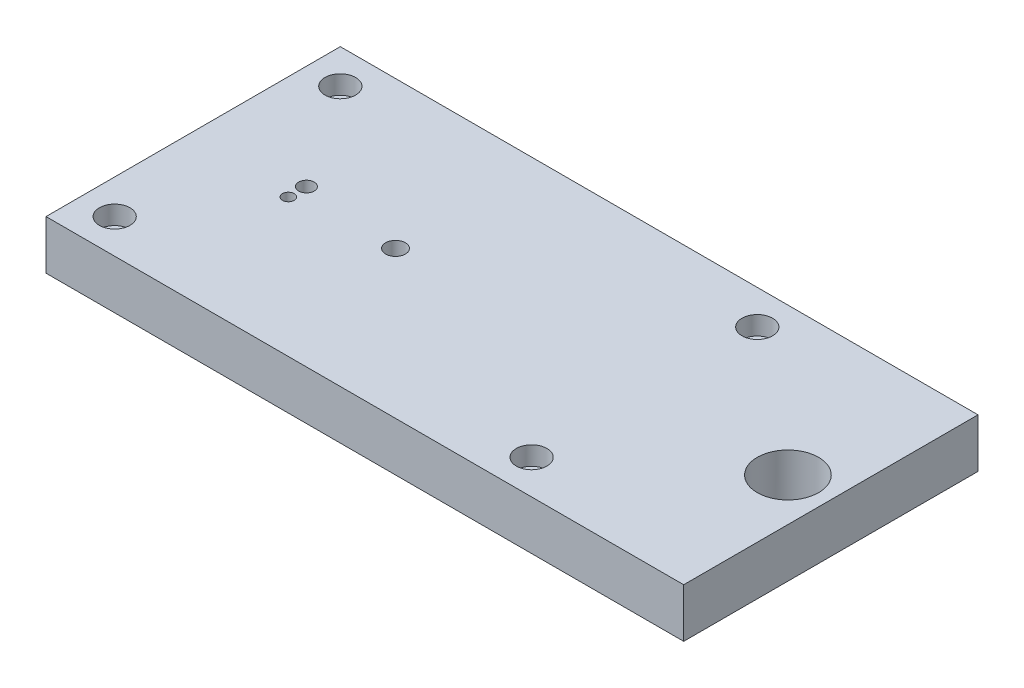
ISO-10303-21;
HEADER;
FILE_DESCRIPTION(('STEP AP214'),'2;1');
FILE_NAME('part.step','',(''),(''),'','','');
FILE_SCHEMA(('AUTOMOTIVE_DESIGN { 1 0 10303 214 1 1 1 1 }'));
ENDSEC;
DATA;
#1=APPLICATION_CONTEXT('core data for automotive mechanical design processes');
#2=APPLICATION_PROTOCOL_DEFINITION('international standard','automotive_design',2000,#1);
#3=PRODUCT_CONTEXT('',#1,'mechanical');
#4=PRODUCT('Part','Part','',(#3));
#5=PRODUCT_RELATED_PRODUCT_CATEGORY('part','',(#4));
#6=PRODUCT_DEFINITION_FORMATION('','',#4);
#7=PRODUCT_DEFINITION_CONTEXT('part definition',#1,'design');
#8=PRODUCT_DEFINITION('design','',#6,#7);
#9=PRODUCT_DEFINITION_SHAPE('','',#8);
#10=(LENGTH_UNIT() NAMED_UNIT(*) SI_UNIT(.MILLI.,.METRE.));
#11=(NAMED_UNIT(*) PLANE_ANGLE_UNIT() SI_UNIT($,.RADIAN.));
#12=(NAMED_UNIT(*) SI_UNIT($,.STERADIAN.) SOLID_ANGLE_UNIT());
#13=UNCERTAINTY_MEASURE_WITH_UNIT(LENGTH_MEASURE(1.E-05),#10,'distance_accuracy_value','');
#14=(GEOMETRIC_REPRESENTATION_CONTEXT(3) GLOBAL_UNCERTAINTY_ASSIGNED_CONTEXT((#13)) GLOBAL_UNIT_ASSIGNED_CONTEXT((#10,
#11,#12)) REPRESENTATION_CONTEXT('',''));
#15=CARTESIAN_POINT('',(0.,0.,0.));
#16=DIRECTION('',(0.,0.,1.));
#17=DIRECTION('',(1.,0.,0.));
#18=AXIS2_PLACEMENT_3D('',#15,#16,#17);
#19=CARTESIAN_POINT('',(-65.243599257885,12.7,52.8381261595547));
#20=DIRECTION('',(1.,0.,0.));
#21=DIRECTION('',(0.,0.,-1.));
#22=AXIS2_PLACEMENT_3D('',#19,#20,#21);
#23=PLANE('',#22);
#24=DIRECTION('',(0.,0.,1.));
#25=VECTOR('',#24,1.);
#26=CARTESIAN_POINT('',(-65.243599257885,0.,52.8381261595547));
#27=LINE('',#26,#25);
#28=CARTESIAN_POINT('',(-65.243599257885,0.,-23.3618738404453));
#29=VERTEX_POINT('',#28);
#30=CARTESIAN_POINT('',(-65.243599257885,0.,52.8381261595547));
#31=VERTEX_POINT('',#30);
#32=EDGE_CURVE('E99',#29,#31,#27,.T.);
#33=ORIENTED_EDGE('',*,*,#32,.T.);
#34=DIRECTION('',(0.,-1.,0.));
#35=VECTOR('',#34,1.);
#36=CARTESIAN_POINT('',(-65.243599257885,12.7,52.8381261595547));
#37=LINE('',#36,#35);
#38=CARTESIAN_POINT('',(-65.243599257885,12.7,52.8381261595547));
#39=VERTEX_POINT('',#38);
#40=EDGE_CURVE('E11',#39,#31,#37,.T.);
#41=ORIENTED_EDGE('',*,*,#40,.F.);
#42=DIRECTION('',(0.,0.,1.));
#43=VECTOR('',#42,1.);
#44=CARTESIAN_POINT('',(-65.243599257885,12.7,52.8381261595547));
#45=LINE('',#44,#43);
#46=CARTESIAN_POINT('',(-65.243599257885,12.7,-23.3618738404453));
#47=VERTEX_POINT('',#46);
#48=EDGE_CURVE('E86',#47,#39,#45,.T.);
#49=ORIENTED_EDGE('',*,*,#48,.F.);
#50=DIRECTION('',(0.,-1.,0.));
#51=VECTOR('',#50,1.);
#52=CARTESIAN_POINT('',(-65.243599257885,12.7,-23.3618738404453));
#53=LINE('',#52,#51);
#54=EDGE_CURVE('E95',#47,#29,#53,.T.);
#55=ORIENTED_EDGE('',*,*,#54,.T.);
#56=EDGE_LOOP('',(#33,#41,#49,#55));
#57=FACE_BOUND('',#56,.T.);
#58=ADVANCED_FACE('F33',(#57),#23,.F.);
#59=CARTESIAN_POINT('',(-65.243599257885,12.7,52.8381261595547));
#60=DIRECTION('',(0.,0.,-1.));
#61=DIRECTION('',(-1.,0.,0.));
#62=AXIS2_PLACEMENT_3D('',#59,#60,#61);
#63=PLANE('',#62);
#64=DIRECTION('',(1.,0.,0.));
#65=VECTOR('',#64,1.);
#66=CARTESIAN_POINT('',(-65.243599257885,0.,52.8381261595547));
#67=LINE('',#66,#65);
#68=CARTESIAN_POINT('',(99.8564007421151,0.,52.8381261595547));
#69=VERTEX_POINT('',#68);
#70=EDGE_CURVE('E90',#31,#69,#67,.T.);
#71=ORIENTED_EDGE('',*,*,#70,.T.);
#72=DIRECTION('',(0.,-1.,0.));
#73=VECTOR('',#72,1.);
#74=CARTESIAN_POINT('',(99.8564007421151,12.7,52.8381261595547));
#75=LINE('',#74,#73);
#76=CARTESIAN_POINT('',(99.8564007421151,12.7,52.8381261595547));
#77=VERTEX_POINT('',#76);
#78=EDGE_CURVE('E42',#77,#69,#75,.T.);
#79=ORIENTED_EDGE('',*,*,#78,.F.);
#80=DIRECTION('',(1.,0.,0.));
#81=VECTOR('',#80,1.);
#82=CARTESIAN_POINT('',(-65.243599257885,12.7,52.8381261595547));
#83=LINE('',#82,#81);
#84=EDGE_CURVE('E81',#39,#77,#83,.T.);
#85=ORIENTED_EDGE('',*,*,#84,.F.);
#86=ORIENTED_EDGE('',*,*,#40,.T.);
#87=EDGE_LOOP('',(#71,#79,#85,#86));
#88=FACE_BOUND('',#87,.T.);
#89=ADVANCED_FACE('F89',(#88),#63,.F.);
#90=CARTESIAN_POINT('',(99.8564007421151,12.7,52.8381261595547));
#91=DIRECTION('',(-1.,0.,0.));
#92=DIRECTION('',(0.,0.,1.));
#93=AXIS2_PLACEMENT_3D('',#90,#91,#92);
#94=PLANE('',#93);
#95=DIRECTION('',(0.,0.,-1.));
#96=VECTOR('',#95,1.);
#97=CARTESIAN_POINT('',(99.8564007421151,0.,52.8381261595547));
#98=LINE('',#97,#96);
#99=CARTESIAN_POINT('',(99.856400742115,0.,-23.3618738404453));
#100=VERTEX_POINT('',#99);
#101=EDGE_CURVE('E68',#69,#100,#98,.T.);
#102=ORIENTED_EDGE('',*,*,#101,.T.);
#103=DIRECTION('',(0.,-1.,0.));
#104=VECTOR('',#103,1.);
#105=CARTESIAN_POINT('',(99.856400742115,12.7,-23.3618738404453));
#106=LINE('',#105,#104);
#107=CARTESIAN_POINT('',(99.856400742115,12.7,-23.3618738404453));
#108=VERTEX_POINT('',#107);
#109=EDGE_CURVE('E91',#108,#100,#106,.T.);
#110=ORIENTED_EDGE('',*,*,#109,.F.);
#111=DIRECTION('',(0.,0.,-1.));
#112=VECTOR('',#111,1.);
#113=CARTESIAN_POINT('',(99.8564007421151,12.7,52.8381261595547));
#114=LINE('',#113,#112);
#115=EDGE_CURVE('E84',#77,#108,#114,.T.);
#116=ORIENTED_EDGE('',*,*,#115,.F.);
#117=ORIENTED_EDGE('',*,*,#78,.T.);
#118=EDGE_LOOP('',(#102,#110,#116,#117));
#119=FACE_BOUND('',#118,.T.);
#120=ADVANCED_FACE('F93',(#119),#94,.F.);
#121=CARTESIAN_POINT('',(-65.243599257885,12.7,-23.3618738404453));
#122=DIRECTION('',(0.,0.,1.));
#123=DIRECTION('',(1.,0.,0.));
#124=AXIS2_PLACEMENT_3D('',#121,#122,#123);
#125=PLANE('',#124);
#126=DIRECTION('',(-1.,0.,0.));
#127=VECTOR('',#126,1.);
#128=CARTESIAN_POINT('',(-65.243599257885,0.,-23.3618738404453));
#129=LINE('',#128,#127);
#130=EDGE_CURVE('E74',#100,#29,#129,.T.);
#131=ORIENTED_EDGE('',*,*,#130,.T.);
#132=ORIENTED_EDGE('',*,*,#54,.F.);
#133=DIRECTION('',(-1.,0.,0.));
#134=VECTOR('',#133,1.);
#135=CARTESIAN_POINT('',(-65.243599257885,12.7,-23.3618738404453));
#136=LINE('',#135,#134);
#137=EDGE_CURVE('E51',#108,#47,#136,.T.);
#138=ORIENTED_EDGE('',*,*,#137,.F.);
#139=ORIENTED_EDGE('',*,*,#109,.T.);
#140=EDGE_LOOP('',(#131,#132,#138,#139));
#141=FACE_BOUND('',#140,.T.);
#142=ADVANCED_FACE('F184',(#141),#125,.F.);
#143=CARTESIAN_POINT('',(0.,12.7,0.));
#144=DIRECTION('',(0.,-1.,0.));
#145=DIRECTION('',(0.,0.,-1.));
#146=AXIS2_PLACEMENT_3D('',#143,#144,#145);
#147=PLANE('',#146);
#148=CARTESIAN_POINT('',(-38.2560992578849,12.7,17.0749261595547));
#149=DIRECTION('',(0.,1.,0.));
#150=DIRECTION('',(0.,0.,1.));
#151=AXIS2_PLACEMENT_3D('',#148,#149,#150);
#152=CIRCLE('',#151,1.524);
#153=CARTESIAN_POINT('',(-38.2560992578849,12.7,18.5989261595547));
#154=VERTEX_POINT('',#153);
#155=EDGE_CURVE('E128',#154,#154,#152,.T.);
#156=ORIENTED_EDGE('',*,*,#155,.F.);
#157=EDGE_LOOP('',(#156));
#158=FACE_BOUND('',#157,.T.);
#159=CARTESIAN_POINT('',(-38.2560992578849,12.7,12.4013261595547));
#160=DIRECTION('',(0.,1.,0.));
#161=DIRECTION('',(0.,0.,1.));
#162=AXIS2_PLACEMENT_3D('',#159,#160,#161);
#163=CIRCLE('',#162,2.0193);
#164=CARTESIAN_POINT('',(-38.2560992578849,12.7,14.4206261595547));
#165=VERTEX_POINT('',#164);
#166=EDGE_CURVE('E118',#165,#165,#163,.T.);
#167=ORIENTED_EDGE('',*,*,#166,.F.);
#168=EDGE_LOOP('',(#167));
#169=FACE_BOUND('',#168,.T.);
#170=CARTESIAN_POINT('',(-12.856099257885,12.7,14.7381261595547));
#171=DIRECTION('',(0.,1.,0.));
#172=DIRECTION('',(0.,0.,1.));
#173=AXIS2_PLACEMENT_3D('',#170,#171,#172);
#174=CIRCLE('',#173,2.5527);
#175=CARTESIAN_POINT('',(-12.856099257885,12.7,17.2908261595547));
#176=VERTEX_POINT('',#175);
#177=EDGE_CURVE('E115',#176,#176,#174,.T.);
#178=ORIENTED_EDGE('',*,*,#177,.F.);
#179=EDGE_LOOP('',(#178));
#180=FACE_BOUND('',#179,.T.);
#181=CARTESIAN_POINT('',(88.743900742115,12.7,14.7381261595547));
#182=DIRECTION('',(0.,1.,0.));
#183=DIRECTION('',(0.,0.,1.));
#184=AXIS2_PLACEMENT_3D('',#181,#182,#183);
#185=CIRCLE('',#184,7.93749999999999);
#186=CARTESIAN_POINT('',(88.743900742115,12.7,22.6756261595547));
#187=VERTEX_POINT('',#186);
#188=EDGE_CURVE('E112',#187,#187,#185,.T.);
#189=ORIENTED_EDGE('',*,*,#188,.F.);
#190=EDGE_LOOP('',(#189));
#191=FACE_BOUND('',#190,.T.);
#192=CARTESIAN_POINT('',(51.5964007421151,12.7,43.9481261595547));
#193=DIRECTION('',(0.,1.,0.));
#194=DIRECTION('',(0.,0.,1.));
#195=AXIS2_PLACEMENT_3D('',#192,#193,#194);
#196=CIRCLE('',#195,3.96240000000001);
#197=CARTESIAN_POINT('',(51.5964007421151,12.7,47.9105261595547));
#198=VERTEX_POINT('',#197);
#199=EDGE_CURVE('E156',#198,#198,#196,.T.);
#200=ORIENTED_EDGE('',*,*,#199,.F.);
#201=EDGE_LOOP('',(#200));
#202=FACE_BOUND('',#201,.T.);
#203=CARTESIAN_POINT('',(51.5964007421151,12.7,-14.4718738404453));
#204=DIRECTION('',(0.,1.,0.));
#205=DIRECTION('',(0.,0.,1.));
#206=AXIS2_PLACEMENT_3D('',#203,#204,#205);
#207=CIRCLE('',#206,3.9624);
#208=CARTESIAN_POINT('',(51.5964007421151,12.7,-10.5094738404453));
#209=VERTEX_POINT('',#208);
#210=EDGE_CURVE('E160',#209,#209,#207,.T.);
#211=ORIENTED_EDGE('',*,*,#210,.F.);
#212=EDGE_LOOP('',(#211));
#213=FACE_BOUND('',#212,.T.);
#214=CARTESIAN_POINT('',(-56.353599257885,12.7,43.9481261595547));
#215=DIRECTION('',(0.,1.,0.));
#216=DIRECTION('',(0.,0.,1.));
#217=AXIS2_PLACEMENT_3D('',#214,#215,#216);
#218=CIRCLE('',#217,3.9624);
#219=CARTESIAN_POINT('',(-56.353599257885,12.7,47.9105261595547));
#220=VERTEX_POINT('',#219);
#221=EDGE_CURVE('E166',#220,#220,#218,.T.);
#222=ORIENTED_EDGE('',*,*,#221,.F.);
#223=EDGE_LOOP('',(#222));
#224=FACE_BOUND('',#223,.T.);
#225=CARTESIAN_POINT('',(-56.353599257885,12.7,-14.4718738404453));
#226=DIRECTION('',(0.,1.,0.));
#227=DIRECTION('',(0.,0.,1.));
#228=AXIS2_PLACEMENT_3D('',#225,#226,#227);
#229=CIRCLE('',#228,3.9624);
#230=CARTESIAN_POINT('',(-56.353599257885,12.7,-10.5094738404453));
#231=VERTEX_POINT('',#230);
#232=EDGE_CURVE('E172',#231,#231,#229,.T.);
#233=ORIENTED_EDGE('',*,*,#232,.F.);
#234=EDGE_LOOP('',(#233));
#235=FACE_BOUND('',#234,.T.);
#236=ORIENTED_EDGE('',*,*,#48,.T.);
#237=ORIENTED_EDGE('',*,*,#84,.T.);
#238=ORIENTED_EDGE('',*,*,#115,.T.);
#239=ORIENTED_EDGE('',*,*,#137,.T.);
#240=EDGE_LOOP('',(#236,#237,#238,#239));
#241=FACE_BOUND('',#240,.T.);
#242=ADVANCED_FACE('F82',(#158,#169,#180,#191,#202,#213,#224,#235,#241),#147,.F.);
#243=CARTESIAN_POINT('',(0.,0.,0.));
#244=DIRECTION('',(0.,-1.,0.));
#245=DIRECTION('',(0.,0.,-1.));
#246=AXIS2_PLACEMENT_3D('',#243,#244,#245);
#247=PLANE('',#246);
#248=CARTESIAN_POINT('',(-38.2560992578849,0.,17.0749261595547));
#249=DIRECTION('',(0.,-1.,0.));
#250=DIRECTION('',(0.,0.,-1.));
#251=AXIS2_PLACEMENT_3D('',#248,#249,#250);
#252=CIRCLE('',#251,1.524);
#253=CARTESIAN_POINT('',(-38.2560992578849,0.,15.5509261595547));
#254=VERTEX_POINT('',#253);
#255=EDGE_CURVE('E36',#254,#254,#252,.T.);
#256=ORIENTED_EDGE('',*,*,#255,.F.);
#257=EDGE_LOOP('',(#256));
#258=FACE_BOUND('',#257,.T.);
#259=CARTESIAN_POINT('',(-38.2560992578849,0.,12.4013261595547));
#260=DIRECTION('',(0.,-1.,0.));
#261=DIRECTION('',(0.,0.,-1.));
#262=AXIS2_PLACEMENT_3D('',#259,#260,#261);
#263=CIRCLE('',#262,2.0193);
#264=CARTESIAN_POINT('',(-38.2560992578849,0.,10.3820261595547));
#265=VERTEX_POINT('',#264);
#266=EDGE_CURVE('E116',#265,#265,#263,.T.);
#267=ORIENTED_EDGE('',*,*,#266,.F.);
#268=EDGE_LOOP('',(#267));
#269=FACE_BOUND('',#268,.T.);
#270=CARTESIAN_POINT('',(-12.856099257885,0.,14.7381261595547));
#271=DIRECTION('',(0.,-1.,0.));
#272=DIRECTION('',(0.,0.,-1.));
#273=AXIS2_PLACEMENT_3D('',#270,#271,#272);
#274=CIRCLE('',#273,2.5527);
#275=CARTESIAN_POINT('',(-12.856099257885,0.,12.1854261595547));
#276=VERTEX_POINT('',#275);
#277=EDGE_CURVE('E113',#276,#276,#274,.T.);
#278=ORIENTED_EDGE('',*,*,#277,.F.);
#279=EDGE_LOOP('',(#278));
#280=FACE_BOUND('',#279,.T.);
#281=CARTESIAN_POINT('',(88.743900742115,0.,14.7381261595547));
#282=DIRECTION('',(0.,-1.,0.));
#283=DIRECTION('',(0.,0.,-1.));
#284=AXIS2_PLACEMENT_3D('',#281,#282,#283);
#285=CIRCLE('',#284,7.93749999999999);
#286=CARTESIAN_POINT('',(88.743900742115,0.,6.80062615955474));
#287=VERTEX_POINT('',#286);
#288=EDGE_CURVE('E108',#287,#287,#285,.T.);
#289=ORIENTED_EDGE('',*,*,#288,.F.);
#290=EDGE_LOOP('',(#289));
#291=FACE_BOUND('',#290,.T.);
#292=CARTESIAN_POINT('',(51.5964007421151,0.,43.9481261595547));
#293=DIRECTION('',(0.,-1.,0.));
#294=DIRECTION('',(0.,0.,-1.));
#295=AXIS2_PLACEMENT_3D('',#292,#293,#294);
#296=CIRCLE('',#295,2.55270000000001);
#297=CARTESIAN_POINT('',(51.5964007421151,0.,41.3954261595547));
#298=VERTEX_POINT('',#297);
#299=EDGE_CURVE('E135',#298,#298,#296,.T.);
#300=ORIENTED_EDGE('',*,*,#299,.F.);
#301=EDGE_LOOP('',(#300));
#302=FACE_BOUND('',#301,.T.);
#303=CARTESIAN_POINT('',(51.5964007421151,0.,-14.4718738404453));
#304=DIRECTION('',(0.,-1.,0.));
#305=DIRECTION('',(0.,0.,-1.));
#306=AXIS2_PLACEMENT_3D('',#303,#304,#305);
#307=CIRCLE('',#306,2.55270000000001);
#308=CARTESIAN_POINT('',(51.5964007421151,0.,-17.0245738404453));
#309=VERTEX_POINT('',#308);
#310=EDGE_CURVE('E141',#309,#309,#307,.T.);
#311=ORIENTED_EDGE('',*,*,#310,.F.);
#312=EDGE_LOOP('',(#311));
#313=FACE_BOUND('',#312,.T.);
#314=CARTESIAN_POINT('',(-56.353599257885,0.,-14.4718738404453));
#315=DIRECTION('',(0.,-1.,0.));
#316=DIRECTION('',(0.,0.,-1.));
#317=AXIS2_PLACEMENT_3D('',#314,#315,#316);
#318=CIRCLE('',#317,2.5527);
#319=CARTESIAN_POINT('',(-56.353599257885,0.,-17.0245738404453));
#320=VERTEX_POINT('',#319);
#321=EDGE_CURVE('E147',#320,#320,#318,.T.);
#322=ORIENTED_EDGE('',*,*,#321,.F.);
#323=EDGE_LOOP('',(#322));
#324=FACE_BOUND('',#323,.T.);
#325=CARTESIAN_POINT('',(-56.353599257885,0.,43.9481261595547));
#326=DIRECTION('',(0.,-1.,0.));
#327=DIRECTION('',(0.,0.,-1.));
#328=AXIS2_PLACEMENT_3D('',#325,#326,#327);
#329=CIRCLE('',#328,2.5527);
#330=CARTESIAN_POINT('',(-56.353599257885,0.,41.3954261595547));
#331=VERTEX_POINT('',#330);
#332=EDGE_CURVE('E153',#331,#331,#329,.T.);
#333=ORIENTED_EDGE('',*,*,#332,.F.);
#334=EDGE_LOOP('',(#333));
#335=FACE_BOUND('',#334,.T.);
#336=ORIENTED_EDGE('',*,*,#32,.F.);
#337=ORIENTED_EDGE('',*,*,#130,.F.);
#338=ORIENTED_EDGE('',*,*,#101,.F.);
#339=ORIENTED_EDGE('',*,*,#70,.F.);
#340=EDGE_LOOP('',(#336,#337,#338,#339));
#341=FACE_BOUND('',#340,.T.);
#342=ADVANCED_FACE('F183',(#258,#269,#280,#291,#302,#313,#324,#335,#341),#247,.T.);
#343=CARTESIAN_POINT('',(-56.353599257885,7.874,-14.4718738404453));
#344=DIRECTION('',(0.,1.,0.));
#345=DIRECTION('',(0.,0.,1.));
#346=AXIS2_PLACEMENT_3D('',#343,#344,#345);
#347=CYLINDRICAL_SURFACE('',#346,3.9624);
#348=CARTESIAN_POINT('',(-56.353599257885,7.874,-14.4718738404453));
#349=DIRECTION('',(0.,1.,0.));
#350=DIRECTION('',(0.,0.,1.));
#351=AXIS2_PLACEMENT_3D('',#348,#349,#350);
#352=CIRCLE('',#351,3.9624);
#353=CARTESIAN_POINT('',(-56.353599257885,7.874,-10.5094738404453));
#354=VERTEX_POINT('',#353);
#355=EDGE_CURVE('E102',#354,#354,#352,.T.);
#356=ORIENTED_EDGE('',*,*,#355,.F.);
#357=EDGE_LOOP('',(#356));
#358=FACE_BOUND('',#357,.T.);
#359=ORIENTED_EDGE('',*,*,#232,.T.);
#360=EDGE_LOOP('',(#359));
#361=FACE_BOUND('',#360,.T.);
#362=ADVANCED_FACE('F180',(#358,#361),#347,.F.);
#363=CARTESIAN_POINT('',(-56.353599257885,7.874,-14.4718738404453));
#364=DIRECTION('',(0.,1.,0.));
#365=DIRECTION('',(0.,0.,1.));
#366=AXIS2_PLACEMENT_3D('',#363,#364,#365);
#367=PLANE('',#366);
#368=CARTESIAN_POINT('',(-56.353599257885,7.874,-14.4718738404453));
#369=DIRECTION('',(0.,1.,0.));
#370=DIRECTION('',(0.,0.,1.));
#371=AXIS2_PLACEMENT_3D('',#368,#369,#370);
#372=CIRCLE('',#371,2.5527);
#373=CARTESIAN_POINT('',(-56.353599257885,7.874,-11.9191738404453));
#374=VERTEX_POINT('',#373);
#375=EDGE_CURVE('E144',#374,#374,#372,.T.);
#376=ORIENTED_EDGE('',*,*,#375,.F.);
#377=EDGE_LOOP('',(#376));
#378=FACE_BOUND('',#377,.T.);
#379=ORIENTED_EDGE('',*,*,#355,.T.);
#380=EDGE_LOOP('',(#379));
#381=FACE_BOUND('',#380,.T.);
#382=ADVANCED_FACE('F224',(#378,#381),#367,.T.);
#383=CARTESIAN_POINT('',(-56.353599257885,7.874,43.9481261595547));
#384=DIRECTION('',(0.,1.,0.));
#385=DIRECTION('',(0.,0.,1.));
#386=AXIS2_PLACEMENT_3D('',#383,#384,#385);
#387=CYLINDRICAL_SURFACE('',#386,3.9624);
#388=CARTESIAN_POINT('',(-56.353599257885,7.874,43.9481261595547));
#389=DIRECTION('',(0.,1.,0.));
#390=DIRECTION('',(0.,0.,1.));
#391=AXIS2_PLACEMENT_3D('',#388,#389,#390);
#392=CIRCLE('',#391,3.9624);
#393=CARTESIAN_POINT('',(-56.353599257885,7.874,47.9105261595547));
#394=VERTEX_POINT('',#393);
#395=EDGE_CURVE('E169',#394,#394,#392,.T.);
#396=ORIENTED_EDGE('',*,*,#395,.F.);
#397=EDGE_LOOP('',(#396));
#398=FACE_BOUND('',#397,.T.);
#399=ORIENTED_EDGE('',*,*,#221,.T.);
#400=EDGE_LOOP('',(#399));
#401=FACE_BOUND('',#400,.T.);
#402=ADVANCED_FACE('F234',(#398,#401),#387,.F.);
#403=CARTESIAN_POINT('',(-56.353599257885,7.874,43.9481261595547));
#404=DIRECTION('',(0.,1.,0.));
#405=DIRECTION('',(0.,0.,1.));
#406=AXIS2_PLACEMENT_3D('',#403,#404,#405);
#407=PLANE('',#406);
#408=CARTESIAN_POINT('',(-56.353599257885,7.874,43.9481261595547));
#409=DIRECTION('',(0.,1.,0.));
#410=DIRECTION('',(0.,0.,1.));
#411=AXIS2_PLACEMENT_3D('',#408,#409,#410);
#412=CIRCLE('',#411,2.5527);
#413=CARTESIAN_POINT('',(-56.353599257885,7.874,46.5008261595547));
#414=VERTEX_POINT('',#413);
#415=EDGE_CURVE('E150',#414,#414,#412,.T.);
#416=ORIENTED_EDGE('',*,*,#415,.F.);
#417=EDGE_LOOP('',(#416));
#418=FACE_BOUND('',#417,.T.);
#419=ORIENTED_EDGE('',*,*,#395,.T.);
#420=EDGE_LOOP('',(#419));
#421=FACE_BOUND('',#420,.T.);
#422=ADVANCED_FACE('F244',(#418,#421),#407,.T.);
#423=CARTESIAN_POINT('',(51.5964007421151,7.874,-14.4718738404453));
#424=DIRECTION('',(0.,1.,0.));
#425=DIRECTION('',(0.,0.,1.));
#426=AXIS2_PLACEMENT_3D('',#423,#424,#425);
#427=CYLINDRICAL_SURFACE('',#426,3.9624);
#428=CARTESIAN_POINT('',(51.5964007421151,7.874,-14.4718738404453));
#429=DIRECTION('',(0.,1.,0.));
#430=DIRECTION('',(0.,0.,1.));
#431=AXIS2_PLACEMENT_3D('',#428,#429,#430);
#432=CIRCLE('',#431,3.9624);
#433=CARTESIAN_POINT('',(51.5964007421151,7.874,-10.5094738404453));
#434=VERTEX_POINT('',#433);
#435=EDGE_CURVE('E163',#434,#434,#432,.T.);
#436=ORIENTED_EDGE('',*,*,#435,.F.);
#437=EDGE_LOOP('',(#436));
#438=FACE_BOUND('',#437,.T.);
#439=ORIENTED_EDGE('',*,*,#210,.T.);
#440=EDGE_LOOP('',(#439));
#441=FACE_BOUND('',#440,.T.);
#442=ADVANCED_FACE('F254',(#438,#441),#427,.F.);
#443=CARTESIAN_POINT('',(51.5964007421151,7.874,-14.4718738404453));
#444=DIRECTION('',(0.,1.,0.));
#445=DIRECTION('',(0.,0.,1.));
#446=AXIS2_PLACEMENT_3D('',#443,#444,#445);
#447=PLANE('',#446);
#448=CARTESIAN_POINT('',(51.5964007421151,7.874,-14.4718738404453));
#449=DIRECTION('',(0.,1.,0.));
#450=DIRECTION('',(0.,0.,1.));
#451=AXIS2_PLACEMENT_3D('',#448,#449,#450);
#452=CIRCLE('',#451,2.55270000000001);
#453=CARTESIAN_POINT('',(51.5964007421151,7.874,-11.9191738404453));
#454=VERTEX_POINT('',#453);
#455=EDGE_CURVE('E138',#454,#454,#452,.T.);
#456=ORIENTED_EDGE('',*,*,#455,.F.);
#457=EDGE_LOOP('',(#456));
#458=FACE_BOUND('',#457,.T.);
#459=ORIENTED_EDGE('',*,*,#435,.T.);
#460=EDGE_LOOP('',(#459));
#461=FACE_BOUND('',#460,.T.);
#462=ADVANCED_FACE('F264',(#458,#461),#447,.T.);
#463=CARTESIAN_POINT('',(51.5964007421151,7.874,43.9481261595547));
#464=DIRECTION('',(0.,1.,0.));
#465=DIRECTION('',(0.,0.,1.));
#466=AXIS2_PLACEMENT_3D('',#463,#464,#465);
#467=CYLINDRICAL_SURFACE('',#466,3.96240000000001);
#468=CARTESIAN_POINT('',(51.5964007421151,7.874,43.9481261595547));
#469=DIRECTION('',(0.,1.,0.));
#470=DIRECTION('',(0.,0.,1.));
#471=AXIS2_PLACEMENT_3D('',#468,#469,#470);
#472=CIRCLE('',#471,3.96240000000001);
#473=CARTESIAN_POINT('',(51.5964007421151,7.874,47.9105261595547));
#474=VERTEX_POINT('',#473);
#475=EDGE_CURVE('E157',#474,#474,#472,.T.);
#476=ORIENTED_EDGE('',*,*,#475,.F.);
#477=EDGE_LOOP('',(#476));
#478=FACE_BOUND('',#477,.T.);
#479=ORIENTED_EDGE('',*,*,#199,.T.);
#480=EDGE_LOOP('',(#479));
#481=FACE_BOUND('',#480,.T.);
#482=ADVANCED_FACE('F274',(#478,#481),#467,.F.);
#483=CARTESIAN_POINT('',(51.5964007421151,7.874,43.9481261595547));
#484=DIRECTION('',(0.,1.,0.));
#485=DIRECTION('',(0.,0.,1.));
#486=AXIS2_PLACEMENT_3D('',#483,#484,#485);
#487=PLANE('',#486);
#488=CARTESIAN_POINT('',(51.5964007421151,7.874,43.9481261595547));
#489=DIRECTION('',(0.,1.,0.));
#490=DIRECTION('',(0.,0.,1.));
#491=AXIS2_PLACEMENT_3D('',#488,#489,#490);
#492=CIRCLE('',#491,2.55270000000001);
#493=CARTESIAN_POINT('',(51.5964007421151,7.874,46.5008261595547));
#494=VERTEX_POINT('',#493);
#495=EDGE_CURVE('E111',#494,#494,#492,.T.);
#496=ORIENTED_EDGE('',*,*,#495,.F.);
#497=EDGE_LOOP('',(#496));
#498=FACE_BOUND('',#497,.T.);
#499=ORIENTED_EDGE('',*,*,#475,.T.);
#500=EDGE_LOOP('',(#499));
#501=FACE_BOUND('',#500,.T.);
#502=ADVANCED_FACE('F284',(#498,#501),#487,.T.);
#503=CARTESIAN_POINT('',(-56.353599257885,-9.65200000000001,43.9481261595547));
#504=DIRECTION('',(0.,1.,0.));
#505=DIRECTION('',(0.,0.,1.));
#506=AXIS2_PLACEMENT_3D('',#503,#504,#505);
#507=CYLINDRICAL_SURFACE('',#506,2.5527);
#508=ORIENTED_EDGE('',*,*,#332,.T.);
#509=EDGE_LOOP('',(#508));
#510=FACE_BOUND('',#509,.T.);
#511=ORIENTED_EDGE('',*,*,#415,.T.);
#512=EDGE_LOOP('',(#511));
#513=FACE_BOUND('',#512,.T.);
#514=ADVANCED_FACE('F294',(#510,#513),#507,.F.);
#515=CARTESIAN_POINT('',(-56.353599257885,-9.65200000000001,-14.4718738404453));
#516=DIRECTION('',(0.,1.,0.));
#517=DIRECTION('',(0.,0.,1.));
#518=AXIS2_PLACEMENT_3D('',#515,#516,#517);
#519=CYLINDRICAL_SURFACE('',#518,2.5527);
#520=ORIENTED_EDGE('',*,*,#321,.T.);
#521=EDGE_LOOP('',(#520));
#522=FACE_BOUND('',#521,.T.);
#523=ORIENTED_EDGE('',*,*,#375,.T.);
#524=EDGE_LOOP('',(#523));
#525=FACE_BOUND('',#524,.T.);
#526=ADVANCED_FACE('F304',(#522,#525),#519,.F.);
#527=CARTESIAN_POINT('',(51.5964007421151,-9.65200000000001,-14.4718738404453));
#528=DIRECTION('',(0.,1.,0.));
#529=DIRECTION('',(0.,0.,1.));
#530=AXIS2_PLACEMENT_3D('',#527,#528,#529);
#531=CYLINDRICAL_SURFACE('',#530,2.55270000000001);
#532=ORIENTED_EDGE('',*,*,#310,.T.);
#533=EDGE_LOOP('',(#532));
#534=FACE_BOUND('',#533,.T.);
#535=ORIENTED_EDGE('',*,*,#455,.T.);
#536=EDGE_LOOP('',(#535));
#537=FACE_BOUND('',#536,.T.);
#538=ADVANCED_FACE('F314',(#534,#537),#531,.F.);
#539=CARTESIAN_POINT('',(51.5964007421151,-9.65200000000001,43.9481261595547));
#540=DIRECTION('',(0.,1.,0.));
#541=DIRECTION('',(0.,0.,1.));
#542=AXIS2_PLACEMENT_3D('',#539,#540,#541);
#543=CYLINDRICAL_SURFACE('',#542,2.55270000000001);
#544=ORIENTED_EDGE('',*,*,#299,.T.);
#545=EDGE_LOOP('',(#544));
#546=FACE_BOUND('',#545,.T.);
#547=ORIENTED_EDGE('',*,*,#495,.T.);
#548=EDGE_LOOP('',(#547));
#549=FACE_BOUND('',#548,.T.);
#550=ADVANCED_FACE('F324',(#546,#549),#543,.F.);
#551=CARTESIAN_POINT('',(88.743900742115,-9.65200000000001,14.7381261595547));
#552=DIRECTION('',(0.,1.,0.));
#553=DIRECTION('',(0.,0.,1.));
#554=AXIS2_PLACEMENT_3D('',#551,#552,#553);
#555=CYLINDRICAL_SURFACE('',#554,7.93749999999999);
#556=ORIENTED_EDGE('',*,*,#288,.T.);
#557=EDGE_LOOP('',(#556));
#558=FACE_BOUND('',#557,.T.);
#559=ORIENTED_EDGE('',*,*,#188,.T.);
#560=EDGE_LOOP('',(#559));
#561=FACE_BOUND('',#560,.T.);
#562=ADVANCED_FACE('F333',(#558,#561),#555,.F.);
#563=CARTESIAN_POINT('',(-12.856099257885,-9.65200000000001,14.7381261595547));
#564=DIRECTION('',(0.,1.,0.));
#565=DIRECTION('',(0.,0.,1.));
#566=AXIS2_PLACEMENT_3D('',#563,#564,#565);
#567=CYLINDRICAL_SURFACE('',#566,2.5527);
#568=ORIENTED_EDGE('',*,*,#277,.T.);
#569=EDGE_LOOP('',(#568));
#570=FACE_BOUND('',#569,.T.);
#571=ORIENTED_EDGE('',*,*,#177,.T.);
#572=EDGE_LOOP('',(#571));
#573=FACE_BOUND('',#572,.T.);
#574=ADVANCED_FACE('F352',(#570,#573),#567,.F.);
#575=CARTESIAN_POINT('',(-38.2560992578849,-9.65200000000001,12.4013261595547));
#576=DIRECTION('',(0.,1.,0.));
#577=DIRECTION('',(0.,0.,1.));
#578=AXIS2_PLACEMENT_3D('',#575,#576,#577);
#579=CYLINDRICAL_SURFACE('',#578,2.0193);
#580=ORIENTED_EDGE('',*,*,#266,.T.);
#581=EDGE_LOOP('',(#580));
#582=FACE_BOUND('',#581,.T.);
#583=ORIENTED_EDGE('',*,*,#166,.T.);
#584=EDGE_LOOP('',(#583));
#585=FACE_BOUND('',#584,.T.);
#586=ADVANCED_FACE('F362',(#582,#585),#579,.F.);
#587=CARTESIAN_POINT('',(-38.2560992578849,-9.65200000000001,17.0749261595547));
#588=DIRECTION('',(0.,1.,0.));
#589=DIRECTION('',(0.,0.,1.));
#590=AXIS2_PLACEMENT_3D('',#587,#588,#589);
#591=CYLINDRICAL_SURFACE('',#590,1.524);
#592=ORIENTED_EDGE('',*,*,#255,.T.);
#593=EDGE_LOOP('',(#592));
#594=FACE_BOUND('',#593,.T.);
#595=ORIENTED_EDGE('',*,*,#155,.T.);
#596=EDGE_LOOP('',(#595));
#597=FACE_BOUND('',#596,.T.);
#598=ADVANCED_FACE('F372',(#594,#597),#591,.F.);
#599=CLOSED_SHELL('',(#58,#89,#120,#142,#242,#342,#362,#382,#402,#422,#442,#462,#482,#502,#514,
#526,#538,#550,#562,#574,#586,#598));
#600=MANIFOLD_SOLID_BREP('B2',#599);
#601=ADVANCED_BREP_SHAPE_REPRESENTATION('',(#18,#600),#14);
#602=SHAPE_DEFINITION_REPRESENTATION(#9,#601);
ENDSEC;
END-ISO-10303-21;
